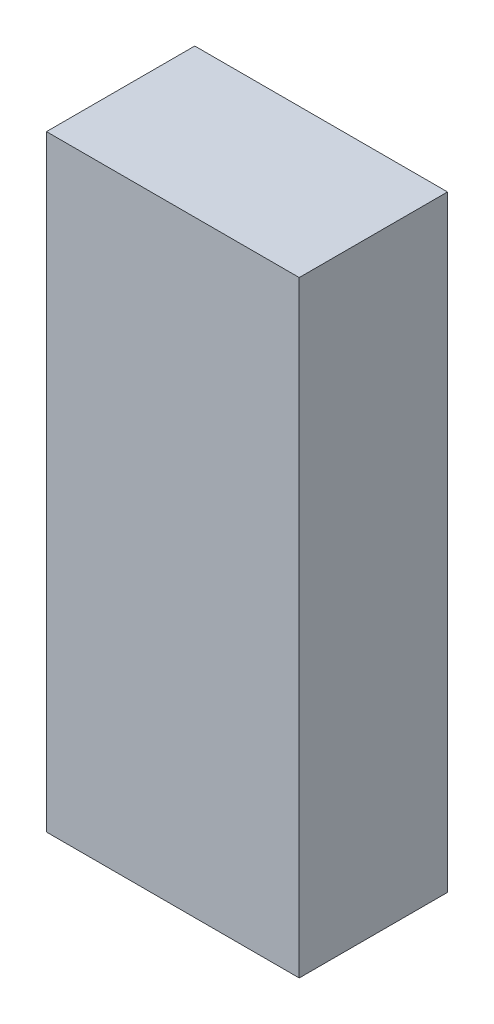
ISO-10303-21;
HEADER;
FILE_DESCRIPTION(('STEP AP214'),'2;1');
FILE_NAME('part.step','',(''),(''),'','','');
FILE_SCHEMA(('AUTOMOTIVE_DESIGN { 1 0 10303 214 1 1 1 1 }'));
ENDSEC;
DATA;
#1=APPLICATION_CONTEXT('core data for automotive mechanical design processes');
#2=APPLICATION_PROTOCOL_DEFINITION('international standard','automotive_design',2000,#1);
#3=PRODUCT_CONTEXT('',#1,'mechanical');
#4=PRODUCT('Part','Part','',(#3));
#5=PRODUCT_RELATED_PRODUCT_CATEGORY('part','',(#4));
#6=PRODUCT_DEFINITION_FORMATION('','',#4);
#7=PRODUCT_DEFINITION_CONTEXT('part definition',#1,'design');
#8=PRODUCT_DEFINITION('design','',#6,#7);
#9=PRODUCT_DEFINITION_SHAPE('','',#8);
#10=(LENGTH_UNIT() NAMED_UNIT(*) SI_UNIT(.MILLI.,.METRE.));
#11=(NAMED_UNIT(*) PLANE_ANGLE_UNIT() SI_UNIT($,.RADIAN.));
#12=(NAMED_UNIT(*) SI_UNIT($,.STERADIAN.) SOLID_ANGLE_UNIT());
#13=UNCERTAINTY_MEASURE_WITH_UNIT(LENGTH_MEASURE(1.E-05),#10,'distance_accuracy_value','');
#14=(GEOMETRIC_REPRESENTATION_CONTEXT(3) GLOBAL_UNCERTAINTY_ASSIGNED_CONTEXT((#13)) GLOBAL_UNIT_ASSIGNED_CONTEXT((#10,
#11,#12)) REPRESENTATION_CONTEXT('',''));
#15=CARTESIAN_POINT('',(0.,0.,0.));
#16=DIRECTION('',(0.,0.,1.));
#17=DIRECTION('',(1.,0.,0.));
#18=AXIS2_PLACEMENT_3D('',#15,#16,#17);
#19=CARTESIAN_POINT('',(0.,0.,5.588));
#20=DIRECTION('',(1.,0.,0.));
#21=DIRECTION('',(0.,0.,-1.));
#22=AXIS2_PLACEMENT_3D('',#19,#20,#21);
#23=PLANE('',#22);
#24=DIRECTION('',(0.,-1.,0.));
#25=VECTOR('',#24,1.);
#26=CARTESIAN_POINT('',(0.,0.,0.));
#27=LINE('',#26,#25);
#28=CARTESIAN_POINT('',(0.,22.86,0.));
#29=VERTEX_POINT('',#28);
#30=CARTESIAN_POINT('',(0.,0.,0.));
#31=VERTEX_POINT('',#30);
#32=EDGE_CURVE('E97',#29,#31,#27,.T.);
#33=ORIENTED_EDGE('',*,*,#32,.T.);
#34=DIRECTION('',(0.,0.,-1.));
#35=VECTOR('',#34,1.);
#36=CARTESIAN_POINT('',(0.,0.,5.588));
#37=LINE('',#36,#35);
#38=CARTESIAN_POINT('',(0.,0.,5.588));
#39=VERTEX_POINT('',#38);
#40=EDGE_CURVE('E11',#39,#31,#37,.T.);
#41=ORIENTED_EDGE('',*,*,#40,.F.);
#42=DIRECTION('',(0.,-1.,0.));
#43=VECTOR('',#42,1.);
#44=CARTESIAN_POINT('',(0.,0.,5.588));
#45=LINE('',#44,#43);
#46=CARTESIAN_POINT('',(0.,22.86,5.588));
#47=VERTEX_POINT('',#46);
#48=EDGE_CURVE('E85',#47,#39,#45,.T.);
#49=ORIENTED_EDGE('',*,*,#48,.F.);
#50=DIRECTION('',(0.,0.,-1.));
#51=VECTOR('',#50,1.);
#52=CARTESIAN_POINT('',(0.,22.86,5.588));
#53=LINE('',#52,#51);
#54=EDGE_CURVE('E93',#47,#29,#53,.T.);
#55=ORIENTED_EDGE('',*,*,#54,.T.);
#56=EDGE_LOOP('',(#33,#41,#49,#55));
#57=FACE_BOUND('',#56,.T.);
#58=ADVANCED_FACE('F34',(#57),#23,.F.);
#59=CARTESIAN_POINT('',(0.,0.,5.588));
#60=DIRECTION('',(0.,1.,0.));
#61=DIRECTION('',(0.,0.,1.));
#62=AXIS2_PLACEMENT_3D('',#59,#60,#61);
#63=PLANE('',#62);
#64=DIRECTION('',(1.,0.,0.));
#65=VECTOR('',#64,1.);
#66=CARTESIAN_POINT('',(0.,0.,0.));
#67=LINE('',#66,#65);
#68=CARTESIAN_POINT('',(9.525,0.,0.));
#69=VERTEX_POINT('',#68);
#70=EDGE_CURVE('E89',#31,#69,#67,.T.);
#71=ORIENTED_EDGE('',*,*,#70,.T.);
#72=DIRECTION('',(0.,0.,-1.));
#73=VECTOR('',#72,1.);
#74=CARTESIAN_POINT('',(9.525,0.,5.588));
#75=LINE('',#74,#73);
#76=CARTESIAN_POINT('',(9.525,0.,5.588));
#77=VERTEX_POINT('',#76);
#78=EDGE_CURVE('E42',#77,#69,#75,.T.);
#79=ORIENTED_EDGE('',*,*,#78,.F.);
#80=DIRECTION('',(1.,0.,0.));
#81=VECTOR('',#80,1.);
#82=CARTESIAN_POINT('',(0.,0.,5.588));
#83=LINE('',#82,#81);
#84=EDGE_CURVE('E80',#39,#77,#83,.T.);
#85=ORIENTED_EDGE('',*,*,#84,.F.);
#86=ORIENTED_EDGE('',*,*,#40,.T.);
#87=EDGE_LOOP('',(#71,#79,#85,#86));
#88=FACE_BOUND('',#87,.T.);
#89=ADVANCED_FACE('F88',(#88),#63,.F.);
#90=CARTESIAN_POINT('',(9.525,0.,5.588));
#91=DIRECTION('',(-1.,0.,0.));
#92=DIRECTION('',(0.,0.,1.));
#93=AXIS2_PLACEMENT_3D('',#90,#91,#92);
#94=PLANE('',#93);
#95=DIRECTION('',(0.,1.,0.));
#96=VECTOR('',#95,1.);
#97=CARTESIAN_POINT('',(9.525,0.,0.));
#98=LINE('',#97,#96);
#99=CARTESIAN_POINT('',(9.525,22.86,0.));
#100=VERTEX_POINT('',#99);
#101=EDGE_CURVE('E67',#69,#100,#98,.T.);
#102=ORIENTED_EDGE('',*,*,#101,.T.);
#103=DIRECTION('',(0.,0.,-1.));
#104=VECTOR('',#103,1.);
#105=CARTESIAN_POINT('',(9.525,22.86,5.588));
#106=LINE('',#105,#104);
#107=CARTESIAN_POINT('',(9.525,22.86,5.588));
#108=VERTEX_POINT('',#107);
#109=EDGE_CURVE('E90',#108,#100,#106,.T.);
#110=ORIENTED_EDGE('',*,*,#109,.F.);
#111=DIRECTION('',(0.,1.,0.));
#112=VECTOR('',#111,1.);
#113=CARTESIAN_POINT('',(9.525,0.,5.588));
#114=LINE('',#113,#112);
#115=EDGE_CURVE('E83',#77,#108,#114,.T.);
#116=ORIENTED_EDGE('',*,*,#115,.F.);
#117=ORIENTED_EDGE('',*,*,#78,.T.);
#118=EDGE_LOOP('',(#102,#110,#116,#117));
#119=FACE_BOUND('',#118,.T.);
#120=ADVANCED_FACE('F91',(#119),#94,.F.);
#121=CARTESIAN_POINT('',(0.,22.86,5.588));
#122=DIRECTION('',(0.,-1.,0.));
#123=DIRECTION('',(0.,0.,-1.));
#124=AXIS2_PLACEMENT_3D('',#121,#122,#123);
#125=PLANE('',#124);
#126=DIRECTION('',(-1.,0.,0.));
#127=VECTOR('',#126,1.);
#128=CARTESIAN_POINT('',(0.,22.86,0.));
#129=LINE('',#128,#127);
#130=EDGE_CURVE('E73',#100,#29,#129,.T.);
#131=ORIENTED_EDGE('',*,*,#130,.T.);
#132=ORIENTED_EDGE('',*,*,#54,.F.);
#133=DIRECTION('',(-1.,0.,0.));
#134=VECTOR('',#133,1.);
#135=CARTESIAN_POINT('',(0.,22.86,5.588));
#136=LINE('',#135,#134);
#137=EDGE_CURVE('E50',#108,#47,#136,.T.);
#138=ORIENTED_EDGE('',*,*,#137,.F.);
#139=ORIENTED_EDGE('',*,*,#109,.T.);
#140=EDGE_LOOP('',(#131,#132,#138,#139));
#141=FACE_BOUND('',#140,.T.);
#142=ADVANCED_FACE('F104',(#141),#125,.F.);
#143=CARTESIAN_POINT('',(0.,0.,5.588));
#144=DIRECTION('',(0.,0.,-1.));
#145=DIRECTION('',(-1.,0.,0.));
#146=AXIS2_PLACEMENT_3D('',#143,#144,#145);
#147=PLANE('',#146);
#148=ORIENTED_EDGE('',*,*,#48,.T.);
#149=ORIENTED_EDGE('',*,*,#84,.T.);
#150=ORIENTED_EDGE('',*,*,#115,.T.);
#151=ORIENTED_EDGE('',*,*,#137,.T.);
#152=EDGE_LOOP('',(#148,#149,#150,#151));
#153=FACE_BOUND('',#152,.T.);
#154=ADVANCED_FACE('F81',(#153),#147,.F.);
#155=CARTESIAN_POINT('',(0.,0.,0.));
#156=DIRECTION('',(0.,0.,-1.));
#157=DIRECTION('',(-1.,0.,0.));
#158=AXIS2_PLACEMENT_3D('',#155,#156,#157);
#159=PLANE('',#158);
#160=ORIENTED_EDGE('',*,*,#32,.F.);
#161=ORIENTED_EDGE('',*,*,#130,.F.);
#162=ORIENTED_EDGE('',*,*,#101,.F.);
#163=ORIENTED_EDGE('',*,*,#70,.F.);
#164=EDGE_LOOP('',(#160,#161,#162,#163));
#165=FACE_BOUND('',#164,.T.);
#166=ADVANCED_FACE('F107',(#165),#159,.T.);
#167=CLOSED_SHELL('',(#58,#89,#120,#142,#154,#166));
#168=MANIFOLD_SOLID_BREP('B2',#167);
#169=ADVANCED_BREP_SHAPE_REPRESENTATION('',(#18,#168),#14);
#170=SHAPE_DEFINITION_REPRESENTATION(#9,#169);
ENDSEC;
END-ISO-10303-21;
